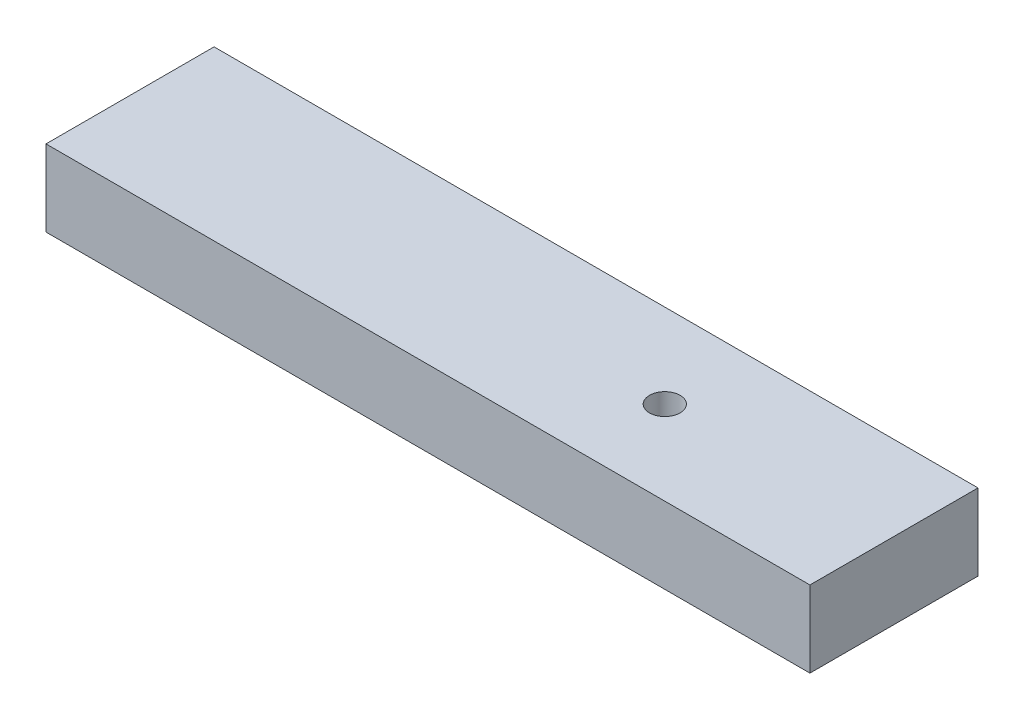
ISO-10303-21;
HEADER;
FILE_DESCRIPTION(('STEP AP214'),'2;1');
FILE_NAME('part.step','',(''),(''),'','','');
FILE_SCHEMA(('AUTOMOTIVE_DESIGN { 1 0 10303 214 1 1 1 1 }'));
ENDSEC;
DATA;
#1=APPLICATION_CONTEXT('core data for automotive mechanical design processes');
#2=APPLICATION_PROTOCOL_DEFINITION('international standard','automotive_design',2000,#1);
#3=PRODUCT_CONTEXT('',#1,'mechanical');
#4=PRODUCT('Part','Part','',(#3));
#5=PRODUCT_RELATED_PRODUCT_CATEGORY('part','',(#4));
#6=PRODUCT_DEFINITION_FORMATION('','',#4);
#7=PRODUCT_DEFINITION_CONTEXT('part definition',#1,'design');
#8=PRODUCT_DEFINITION('design','',#6,#7);
#9=PRODUCT_DEFINITION_SHAPE('','',#8);
#10=(LENGTH_UNIT() NAMED_UNIT(*) SI_UNIT(.MILLI.,.METRE.));
#11=(NAMED_UNIT(*) PLANE_ANGLE_UNIT() SI_UNIT($,.RADIAN.));
#12=(NAMED_UNIT(*) SI_UNIT($,.STERADIAN.) SOLID_ANGLE_UNIT());
#13=UNCERTAINTY_MEASURE_WITH_UNIT(LENGTH_MEASURE(1.E-05),#10,'distance_accuracy_value','');
#14=(GEOMETRIC_REPRESENTATION_CONTEXT(3) GLOBAL_UNCERTAINTY_ASSIGNED_CONTEXT((#13)) GLOBAL_UNIT_ASSIGNED_CONTEXT((#10,
#11,#12)) REPRESENTATION_CONTEXT('',''));
#15=CARTESIAN_POINT('',(0.,0.,0.));
#16=DIRECTION('',(0.,0.,1.));
#17=DIRECTION('',(1.,0.,0.));
#18=AXIS2_PLACEMENT_3D('',#15,#16,#17);
#19=CARTESIAN_POINT('',(125.,25.,-27.5));
#20=DIRECTION('',(-1.,0.,0.));
#21=DIRECTION('',(0.,0.,1.));
#22=AXIS2_PLACEMENT_3D('',#19,#20,#21);
#23=PLANE('',#22);
#24=DIRECTION('',(0.,0.,-1.));
#25=VECTOR('',#24,1.);
#26=CARTESIAN_POINT('',(125.,0.,-27.5));
#27=LINE('',#26,#25);
#28=CARTESIAN_POINT('',(125.,0.,27.5));
#29=VERTEX_POINT('',#28);
#30=CARTESIAN_POINT('',(125.,0.,-27.5));
#31=VERTEX_POINT('',#30);
#32=EDGE_CURVE('E96',#29,#31,#27,.T.);
#33=ORIENTED_EDGE('',*,*,#32,.T.);
#34=DIRECTION('',(0.,-1.,0.));
#35=VECTOR('',#34,1.);
#36=CARTESIAN_POINT('',(125.,25.,-27.5));
#37=LINE('',#36,#35);
#38=CARTESIAN_POINT('',(125.,25.,-27.5));
#39=VERTEX_POINT('',#38);
#40=EDGE_CURVE('E11',#39,#31,#37,.T.);
#41=ORIENTED_EDGE('',*,*,#40,.F.);
#42=DIRECTION('',(0.,0.,-1.));
#43=VECTOR('',#42,1.);
#44=CARTESIAN_POINT('',(125.,25.,-27.5));
#45=LINE('',#44,#43);
#46=CARTESIAN_POINT('',(125.,25.,27.5));
#47=VERTEX_POINT('',#46);
#48=EDGE_CURVE('E84',#47,#39,#45,.T.);
#49=ORIENTED_EDGE('',*,*,#48,.F.);
#50=DIRECTION('',(0.,-1.,0.));
#51=VECTOR('',#50,1.);
#52=CARTESIAN_POINT('',(125.,25.,27.5));
#53=LINE('',#52,#51);
#54=EDGE_CURVE('E92',#47,#29,#53,.T.);
#55=ORIENTED_EDGE('',*,*,#54,.T.);
#56=EDGE_LOOP('',(#33,#41,#49,#55));
#57=FACE_BOUND('',#56,.T.);
#58=ADVANCED_FACE('F33',(#57),#23,.F.);
#59=CARTESIAN_POINT('',(-125.,25.,-27.5));
#60=DIRECTION('',(0.,0.,1.));
#61=DIRECTION('',(1.,0.,0.));
#62=AXIS2_PLACEMENT_3D('',#59,#60,#61);
#63=PLANE('',#62);
#64=DIRECTION('',(-1.,0.,0.));
#65=VECTOR('',#64,1.);
#66=CARTESIAN_POINT('',(-125.,0.,-27.5));
#67=LINE('',#66,#65);
#68=CARTESIAN_POINT('',(-125.,0.,-27.5));
#69=VERTEX_POINT('',#68);
#70=EDGE_CURVE('E88',#31,#69,#67,.T.);
#71=ORIENTED_EDGE('',*,*,#70,.T.);
#72=DIRECTION('',(0.,-1.,0.));
#73=VECTOR('',#72,1.);
#74=CARTESIAN_POINT('',(-125.,25.,-27.5));
#75=LINE('',#74,#73);
#76=CARTESIAN_POINT('',(-125.,25.,-27.5));
#77=VERTEX_POINT('',#76);
#78=EDGE_CURVE('E41',#77,#69,#75,.T.);
#79=ORIENTED_EDGE('',*,*,#78,.F.);
#80=DIRECTION('',(-1.,0.,0.));
#81=VECTOR('',#80,1.);
#82=CARTESIAN_POINT('',(-125.,25.,-27.5));
#83=LINE('',#82,#81);
#84=EDGE_CURVE('E79',#39,#77,#83,.T.);
#85=ORIENTED_EDGE('',*,*,#84,.F.);
#86=ORIENTED_EDGE('',*,*,#40,.T.);
#87=EDGE_LOOP('',(#71,#79,#85,#86));
#88=FACE_BOUND('',#87,.T.);
#89=ADVANCED_FACE('F87',(#88),#63,.F.);
#90=CARTESIAN_POINT('',(-125.,25.,-27.5));
#91=DIRECTION('',(1.,0.,0.));
#92=DIRECTION('',(0.,0.,-1.));
#93=AXIS2_PLACEMENT_3D('',#90,#91,#92);
#94=PLANE('',#93);
#95=DIRECTION('',(0.,0.,1.));
#96=VECTOR('',#95,1.);
#97=CARTESIAN_POINT('',(-125.,0.,-27.5));
#98=LINE('',#97,#96);
#99=CARTESIAN_POINT('',(-125.,0.,27.5));
#100=VERTEX_POINT('',#99);
#101=EDGE_CURVE('E66',#69,#100,#98,.T.);
#102=ORIENTED_EDGE('',*,*,#101,.T.);
#103=DIRECTION('',(0.,-1.,0.));
#104=VECTOR('',#103,1.);
#105=CARTESIAN_POINT('',(-125.,25.,27.5));
#106=LINE('',#105,#104);
#107=CARTESIAN_POINT('',(-125.,25.,27.5));
#108=VERTEX_POINT('',#107);
#109=EDGE_CURVE('E89',#108,#100,#106,.T.);
#110=ORIENTED_EDGE('',*,*,#109,.F.);
#111=DIRECTION('',(0.,0.,1.));
#112=VECTOR('',#111,1.);
#113=CARTESIAN_POINT('',(-125.,25.,-27.5));
#114=LINE('',#113,#112);
#115=EDGE_CURVE('E82',#77,#108,#114,.T.);
#116=ORIENTED_EDGE('',*,*,#115,.F.);
#117=ORIENTED_EDGE('',*,*,#78,.T.);
#118=EDGE_LOOP('',(#102,#110,#116,#117));
#119=FACE_BOUND('',#118,.T.);
#120=ADVANCED_FACE('F90',(#119),#94,.F.);
#121=CARTESIAN_POINT('',(-125.,25.,27.5));
#122=DIRECTION('',(0.,0.,-1.));
#123=DIRECTION('',(-1.,0.,0.));
#124=AXIS2_PLACEMENT_3D('',#121,#122,#123);
#125=PLANE('',#124);
#126=DIRECTION('',(1.,0.,0.));
#127=VECTOR('',#126,1.);
#128=CARTESIAN_POINT('',(-125.,0.,27.5));
#129=LINE('',#128,#127);
#130=EDGE_CURVE('E72',#100,#29,#129,.T.);
#131=ORIENTED_EDGE('',*,*,#130,.T.);
#132=ORIENTED_EDGE('',*,*,#54,.F.);
#133=DIRECTION('',(1.,0.,0.));
#134=VECTOR('',#133,1.);
#135=CARTESIAN_POINT('',(-125.,25.,27.5));
#136=LINE('',#135,#134);
#137=EDGE_CURVE('E49',#108,#47,#136,.T.);
#138=ORIENTED_EDGE('',*,*,#137,.F.);
#139=ORIENTED_EDGE('',*,*,#109,.T.);
#140=EDGE_LOOP('',(#131,#132,#138,#139));
#141=FACE_BOUND('',#140,.T.);
#142=ADVANCED_FACE('F104',(#141),#125,.F.);
#143=CARTESIAN_POINT('',(0.,25.,0.));
#144=DIRECTION('',(0.,1.,0.));
#145=DIRECTION('',(0.,0.,1.));
#146=AXIS2_PLACEMENT_3D('',#143,#144,#145);
#147=PLANE('',#146);
#148=CARTESIAN_POINT('',(50.,25.,0.));
#149=DIRECTION('',(0.,1.,0.));
#150=DIRECTION('',(0.,0.,1.));
#151=AXIS2_PLACEMENT_3D('',#148,#149,#150);
#152=CIRCLE('',#151,5.);
#153=CARTESIAN_POINT('',(50.,25.,5.));
#154=VERTEX_POINT('',#153);
#155=EDGE_CURVE('E110',#154,#154,#152,.T.);
#156=ORIENTED_EDGE('',*,*,#155,.F.);
#157=EDGE_LOOP('',(#156));
#158=FACE_BOUND('',#157,.T.);
#159=ORIENTED_EDGE('',*,*,#48,.T.);
#160=ORIENTED_EDGE('',*,*,#84,.T.);
#161=ORIENTED_EDGE('',*,*,#115,.T.);
#162=ORIENTED_EDGE('',*,*,#137,.T.);
#163=EDGE_LOOP('',(#159,#160,#161,#162));
#164=FACE_BOUND('',#163,.T.);
#165=ADVANCED_FACE('F80',(#158,#164),#147,.T.);
#166=CARTESIAN_POINT('',(0.,0.,0.));
#167=DIRECTION('',(0.,1.,0.));
#168=DIRECTION('',(0.,0.,1.));
#169=AXIS2_PLACEMENT_3D('',#166,#167,#168);
#170=PLANE('',#169);
#171=CARTESIAN_POINT('',(50.,0.,0.));
#172=DIRECTION('',(0.,1.,0.));
#173=DIRECTION('',(0.,0.,1.));
#174=AXIS2_PLACEMENT_3D('',#171,#172,#173);
#175=CIRCLE('',#174,5.);
#176=CARTESIAN_POINT('',(50.,0.,5.));
#177=VERTEX_POINT('',#176);
#178=EDGE_CURVE('E99',#177,#177,#175,.T.);
#179=ORIENTED_EDGE('',*,*,#178,.T.);
#180=EDGE_LOOP('',(#179));
#181=FACE_BOUND('',#180,.T.);
#182=ORIENTED_EDGE('',*,*,#32,.F.);
#183=ORIENTED_EDGE('',*,*,#130,.F.);
#184=ORIENTED_EDGE('',*,*,#101,.F.);
#185=ORIENTED_EDGE('',*,*,#70,.F.);
#186=EDGE_LOOP('',(#182,#183,#184,#185));
#187=FACE_BOUND('',#186,.T.);
#188=ADVANCED_FACE('F107',(#181,#187),#170,.F.);
#189=CARTESIAN_POINT('',(50.,0.,0.));
#190=DIRECTION('',(0.,1.,0.));
#191=DIRECTION('',(0.,0.,1.));
#192=AXIS2_PLACEMENT_3D('',#189,#190,#191);
#193=CYLINDRICAL_SURFACE('',#192,5.);
#194=ORIENTED_EDGE('',*,*,#178,.F.);
#195=EDGE_LOOP('',(#194));
#196=FACE_BOUND('',#195,.T.);
#197=ORIENTED_EDGE('',*,*,#155,.T.);
#198=EDGE_LOOP('',(#197));
#199=FACE_BOUND('',#198,.T.);
#200=ADVANCED_FACE('F117',(#196,#199),#193,.F.);
#201=CLOSED_SHELL('',(#58,#89,#120,#142,#165,#188,#200));
#202=MANIFOLD_SOLID_BREP('B2',#201);
#203=ADVANCED_BREP_SHAPE_REPRESENTATION('',(#18,#202),#14);
#204=SHAPE_DEFINITION_REPRESENTATION(#9,#203);
ENDSEC;
END-ISO-10303-21;
